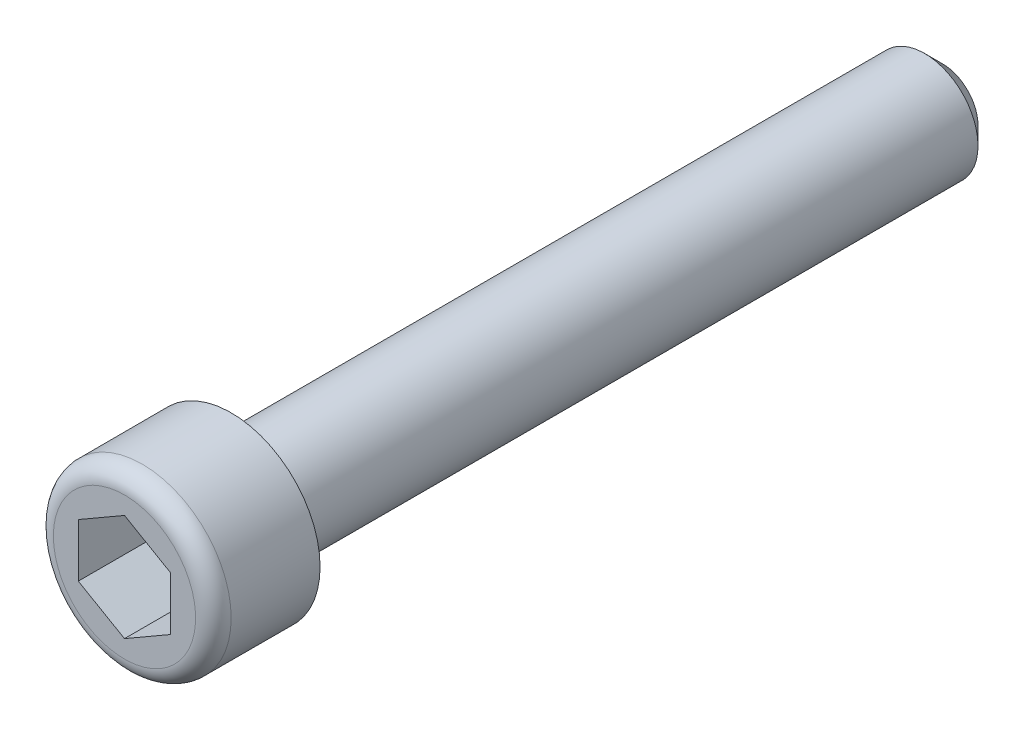
ISO-10303-21;
HEADER;
FILE_DESCRIPTION(('STEP AP214'),'2;1');
FILE_NAME('part.step','',(''),(''),'','','');
FILE_SCHEMA(('AUTOMOTIVE_DESIGN { 1 0 10303 214 1 1 1 1 }'));
ENDSEC;
DATA;
#1=APPLICATION_CONTEXT('core data for automotive mechanical design processes');
#2=APPLICATION_PROTOCOL_DEFINITION('international standard','automotive_design',2000,#1);
#3=PRODUCT_CONTEXT('',#1,'mechanical');
#4=PRODUCT('Part','Part','',(#3));
#5=PRODUCT_RELATED_PRODUCT_CATEGORY('part','',(#4));
#6=PRODUCT_DEFINITION_FORMATION('','',#4);
#7=PRODUCT_DEFINITION_CONTEXT('part definition',#1,'design');
#8=PRODUCT_DEFINITION('design','',#6,#7);
#9=PRODUCT_DEFINITION_SHAPE('','',#8);
#10=(LENGTH_UNIT() NAMED_UNIT(*) SI_UNIT(.MILLI.,.METRE.));
#11=(NAMED_UNIT(*) PLANE_ANGLE_UNIT() SI_UNIT($,.RADIAN.));
#12=(NAMED_UNIT(*) SI_UNIT($,.STERADIAN.) SOLID_ANGLE_UNIT());
#13=UNCERTAINTY_MEASURE_WITH_UNIT(LENGTH_MEASURE(1.E-05),#10,'distance_accuracy_value','');
#14=(GEOMETRIC_REPRESENTATION_CONTEXT(3) GLOBAL_UNCERTAINTY_ASSIGNED_CONTEXT((#13)) GLOBAL_UNIT_ASSIGNED_CONTEXT((#10,
#11,#12)) REPRESENTATION_CONTEXT('',''));
#15=CARTESIAN_POINT('',(0.,0.,0.));
#16=DIRECTION('',(0.,0.,1.));
#17=DIRECTION('',(1.,0.,0.));
#18=AXIS2_PLACEMENT_3D('',#15,#16,#17);
#19=CARTESIAN_POINT('',(0.,0.,0.));
#20=DIRECTION('',(0.,0.,-1.));
#21=DIRECTION('',(-1.,0.,0.));
#22=AXIS2_PLACEMENT_3D('',#19,#20,#21);
#23=PLANE('',#22);
#24=CARTESIAN_POINT('',(0.,0.,0.));
#25=DIRECTION('',(0.,0.,-1.));
#26=DIRECTION('',(-1.,0.,0.));
#27=AXIS2_PLACEMENT_3D('',#24,#25,#26);
#28=CIRCLE('',#27,4.);
#29=CARTESIAN_POINT('',(-4.,0.,0.));
#30=VERTEX_POINT('',#29);
#31=EDGE_CURVE('E41',#30,#30,#28,.F.);
#32=ORIENTED_EDGE('',*,*,#31,.T.);
#33=EDGE_LOOP('',(#32));
#34=FACE_BOUND('',#33,.T.);
#35=DIRECTION('',(-0.866025403784439,-0.5,0.));
#36=VECTOR('',#35,1.);
#37=CARTESIAN_POINT('',(0.,3.,0.));
#38=LINE('',#37,#36);
#39=CARTESIAN_POINT('',(0.,3.,0.));
#40=VERTEX_POINT('',#39);
#41=CARTESIAN_POINT('',(-2.59807621135332,1.5,0.));
#42=VERTEX_POINT('',#41);
#43=EDGE_CURVE('E122',#40,#42,#38,.T.);
#44=ORIENTED_EDGE('',*,*,#43,.F.);
#45=DIRECTION('',(-0.866025403784439,0.5,0.));
#46=VECTOR('',#45,1.);
#47=CARTESIAN_POINT('',(2.59807621135332,1.5,0.));
#48=LINE('',#47,#46);
#49=CARTESIAN_POINT('',(2.59807621135332,1.5,0.));
#50=VERTEX_POINT('',#49);
#51=EDGE_CURVE('E48',#50,#40,#48,.T.);
#52=ORIENTED_EDGE('',*,*,#51,.F.);
#53=DIRECTION('',(0.,1.,0.));
#54=VECTOR('',#53,1.);
#55=CARTESIAN_POINT('',(2.59807621135332,-1.5,0.));
#56=LINE('',#55,#54);
#57=CARTESIAN_POINT('',(2.59807621135332,-1.5,0.));
#58=VERTEX_POINT('',#57);
#59=EDGE_CURVE('E131',#58,#50,#56,.T.);
#60=ORIENTED_EDGE('',*,*,#59,.F.);
#61=DIRECTION('',(0.866025403784439,0.5,0.));
#62=VECTOR('',#61,1.);
#63=CARTESIAN_POINT('',(0.,-3.,0.));
#64=LINE('',#63,#62);
#65=CARTESIAN_POINT('',(0.,-3.,0.));
#66=VERTEX_POINT('',#65);
#67=EDGE_CURVE('E129',#66,#58,#64,.T.);
#68=ORIENTED_EDGE('',*,*,#67,.F.);
#69=DIRECTION('',(0.866025403784439,-0.5,0.));
#70=VECTOR('',#69,1.);
#71=CARTESIAN_POINT('',(-2.59807621135332,-1.5,0.));
#72=LINE('',#71,#70);
#73=CARTESIAN_POINT('',(-2.59807621135332,-1.5,0.));
#74=VERTEX_POINT('',#73);
#75=EDGE_CURVE('E96',#74,#66,#72,.T.);
#76=ORIENTED_EDGE('',*,*,#75,.F.);
#77=DIRECTION('',(0.,-1.,0.));
#78=VECTOR('',#77,1.);
#79=CARTESIAN_POINT('',(-2.59807621135332,1.5,0.));
#80=LINE('',#79,#78);
#81=EDGE_CURVE('E125',#42,#74,#80,.T.);
#82=ORIENTED_EDGE('',*,*,#81,.F.);
#83=EDGE_LOOP('',(#44,#52,#60,#68,#76,#82));
#84=FACE_BOUND('',#83,.T.);
#85=ADVANCED_FACE('F33',(#34,#84),#23,.F.);
#86=CARTESIAN_POINT('',(0.,0.,156.291575098795));
#87=DIRECTION('',(0.,0.,1.));
#88=DIRECTION('',(1.,0.,0.));
#89=AXIS2_PLACEMENT_3D('',#86,#87,#88);
#90=CYLINDRICAL_SURFACE('',#89,5.);
#91=CARTESIAN_POINT('',(0.,0.,-1.));
#92=DIRECTION('',(0.,0.,-1.));
#93=DIRECTION('',(-1.,0.,0.));
#94=AXIS2_PLACEMENT_3D('',#91,#92,#93);
#95=CIRCLE('',#94,5.);
#96=CARTESIAN_POINT('',(-5.,0.,-1.));
#97=VERTEX_POINT('',#96);
#98=EDGE_CURVE('E11',#97,#97,#95,.T.);
#99=ORIENTED_EDGE('',*,*,#98,.T.);
#100=EDGE_LOOP('',(#99));
#101=FACE_BOUND('',#100,.T.);
#102=CARTESIAN_POINT('',(0.,0.,-6.00000000000001));
#103=DIRECTION('',(0.,0.,1.));
#104=DIRECTION('',(1.,0.,0.));
#105=AXIS2_PLACEMENT_3D('',#102,#103,#104);
#106=CIRCLE('',#105,5.);
#107=CARTESIAN_POINT('',(5.,0.,-6.00000000000001));
#108=VERTEX_POINT('',#107);
#109=EDGE_CURVE('E143',#108,#108,#106,.T.);
#110=ORIENTED_EDGE('',*,*,#109,.T.);
#111=EDGE_LOOP('',(#110));
#112=FACE_BOUND('',#111,.T.);
#113=ADVANCED_FACE('F165',(#101,#112),#90,.T.);
#114=CARTESIAN_POINT('',(0.,5.,-6.));
#115=DIRECTION('',(0.,0.,1.));
#116=DIRECTION('',(1.,0.,0.));
#117=AXIS2_PLACEMENT_3D('',#114,#115,#116);
#118=PLANE('',#117);
#119=ORIENTED_EDGE('',*,*,#109,.F.);
#120=EDGE_LOOP('',(#119));
#121=FACE_BOUND('',#120,.T.);
#122=CARTESIAN_POINT('',(0.,0.,-6.00000000000001));
#123=DIRECTION('',(0.,0.,1.));
#124=DIRECTION('',(1.,0.,0.));
#125=AXIS2_PLACEMENT_3D('',#122,#123,#124);
#126=CIRCLE('',#125,3.);
#127=CARTESIAN_POINT('',(3.,0.,-6.00000000000001));
#128=VERTEX_POINT('',#127);
#129=EDGE_CURVE('E135',#128,#128,#126,.T.);
#130=ORIENTED_EDGE('',*,*,#129,.T.);
#131=EDGE_LOOP('',(#130));
#132=FACE_BOUND('',#131,.T.);
#133=ADVANCED_FACE('F170',(#121,#132),#118,.F.);
#134=CARTESIAN_POINT('',(0.,0.,156.291575098795));
#135=DIRECTION('',(0.,0.,1.));
#136=DIRECTION('',(1.,0.,0.));
#137=AXIS2_PLACEMENT_3D('',#134,#135,#136);
#138=CYLINDRICAL_SURFACE('',#137,3.);
#139=CARTESIAN_POINT('',(0.,0.,-45.));
#140=DIRECTION('',(0.,0.,1.));
#141=DIRECTION('',(1.,0.,0.));
#142=AXIS2_PLACEMENT_3D('',#139,#140,#141);
#143=CIRCLE('',#142,3.);
#144=CARTESIAN_POINT('',(3.,0.,-45.));
#145=VERTEX_POINT('',#144);
#146=EDGE_CURVE('E146',#145,#145,#143,.T.);
#147=ORIENTED_EDGE('',*,*,#146,.T.);
#148=EDGE_LOOP('',(#147));
#149=FACE_BOUND('',#148,.T.);
#150=ORIENTED_EDGE('',*,*,#129,.F.);
#151=EDGE_LOOP('',(#150));
#152=FACE_BOUND('',#151,.T.);
#153=ADVANCED_FACE('F176',(#149,#152),#138,.T.);
#154=CARTESIAN_POINT('',(0.,3.,-46.));
#155=DIRECTION('',(0.,0.,1.));
#156=DIRECTION('',(1.,0.,0.));
#157=AXIS2_PLACEMENT_3D('',#154,#155,#156);
#158=PLANE('',#157);
#159=CARTESIAN_POINT('',(0.,0.,-46.));
#160=DIRECTION('',(0.,0.,1.));
#161=DIRECTION('',(1.,0.,0.));
#162=AXIS2_PLACEMENT_3D('',#159,#160,#161);
#163=CIRCLE('',#162,1.99999999999999);
#164=CARTESIAN_POINT('',(1.99999999999999,0.,-46.));
#165=VERTEX_POINT('',#164);
#166=EDGE_CURVE('E149',#165,#165,#163,.F.);
#167=ORIENTED_EDGE('',*,*,#166,.T.);
#168=EDGE_LOOP('',(#167));
#169=FACE_BOUND('',#168,.T.);
#170=ADVANCED_FACE('F180',(#169),#158,.F.);
#171=CARTESIAN_POINT('',(2.59807621135332,1.5,-4.5));
#172=DIRECTION('',(0.5,0.866025403784439,0.));
#173=DIRECTION('',(-0.866025403784439,0.5,0.));
#174=AXIS2_PLACEMENT_3D('',#171,#172,#173);
#175=PLANE('',#174);
#176=ORIENTED_EDGE('',*,*,#51,.T.);
#177=DIRECTION('',(0.,0.,1.));
#178=VECTOR('',#177,1.);
#179=CARTESIAN_POINT('',(0.,3.,-4.5));
#180=LINE('',#179,#178);
#181=CARTESIAN_POINT('',(0.,3.,-4.5));
#182=VERTEX_POINT('',#181);
#183=EDGE_CURVE('E78',#182,#40,#180,.T.);
#184=ORIENTED_EDGE('',*,*,#183,.F.);
#185=DIRECTION('',(-0.866025403784439,0.5,0.));
#186=VECTOR('',#185,1.);
#187=CARTESIAN_POINT('',(2.59807621135332,1.5,-4.5));
#188=LINE('',#187,#186);
#189=CARTESIAN_POINT('',(2.59807621135332,1.5,-4.5));
#190=VERTEX_POINT('',#189);
#191=EDGE_CURVE('E133',#190,#182,#188,.T.);
#192=ORIENTED_EDGE('',*,*,#191,.F.);
#193=DIRECTION('',(0.,0.,1.));
#194=VECTOR('',#193,1.);
#195=CARTESIAN_POINT('',(2.59807621135332,1.5,-4.5));
#196=LINE('',#195,#194);
#197=EDGE_CURVE('E56',#190,#50,#196,.T.);
#198=ORIENTED_EDGE('',*,*,#197,.T.);
#199=EDGE_LOOP('',(#176,#184,#192,#198));
#200=FACE_BOUND('',#199,.T.);
#201=ADVANCED_FACE('F184',(#200),#175,.F.);
#202=CARTESIAN_POINT('',(2.59807621135332,-1.5,-4.5));
#203=DIRECTION('',(1.,0.,0.));
#204=DIRECTION('',(0.,1.,0.));
#205=AXIS2_PLACEMENT_3D('',#202,#203,#204);
#206=PLANE('',#205);
#207=ORIENTED_EDGE('',*,*,#59,.T.);
#208=ORIENTED_EDGE('',*,*,#197,.F.);
#209=DIRECTION('',(0.,1.,0.));
#210=VECTOR('',#209,1.);
#211=CARTESIAN_POINT('',(2.59807621135332,-1.5,-4.5));
#212=LINE('',#211,#210);
#213=CARTESIAN_POINT('',(2.59807621135332,-1.5,-4.5));
#214=VERTEX_POINT('',#213);
#215=EDGE_CURVE('E108',#214,#190,#212,.T.);
#216=ORIENTED_EDGE('',*,*,#215,.F.);
#217=DIRECTION('',(0.,0.,1.));
#218=VECTOR('',#217,1.);
#219=CARTESIAN_POINT('',(2.59807621135332,-1.5,-4.5));
#220=LINE('',#219,#218);
#221=EDGE_CURVE('E100',#214,#58,#220,.T.);
#222=ORIENTED_EDGE('',*,*,#221,.T.);
#223=EDGE_LOOP('',(#207,#208,#216,#222));
#224=FACE_BOUND('',#223,.T.);
#225=ADVANCED_FACE('F188',(#224),#206,.F.);
#226=CARTESIAN_POINT('',(0.,-3.,-4.5));
#227=DIRECTION('',(0.5,-0.866025403784439,0.));
#228=DIRECTION('',(0.866025403784439,0.5,0.));
#229=AXIS2_PLACEMENT_3D('',#226,#227,#228);
#230=PLANE('',#229);
#231=ORIENTED_EDGE('',*,*,#67,.T.);
#232=ORIENTED_EDGE('',*,*,#221,.F.);
#233=DIRECTION('',(0.866025403784439,0.5,0.));
#234=VECTOR('',#233,1.);
#235=CARTESIAN_POINT('',(0.,-3.,-4.5));
#236=LINE('',#235,#234);
#237=CARTESIAN_POINT('',(0.,-3.,-4.5));
#238=VERTEX_POINT('',#237);
#239=EDGE_CURVE('E104',#238,#214,#236,.T.);
#240=ORIENTED_EDGE('',*,*,#239,.F.);
#241=DIRECTION('',(0.,0.,1.));
#242=VECTOR('',#241,1.);
#243=CARTESIAN_POINT('',(0.,-3.,-4.5));
#244=LINE('',#243,#242);
#245=EDGE_CURVE('E89',#238,#66,#244,.T.);
#246=ORIENTED_EDGE('',*,*,#245,.T.);
#247=EDGE_LOOP('',(#231,#232,#240,#246));
#248=FACE_BOUND('',#247,.T.);
#249=ADVANCED_FACE('F105',(#248),#230,.F.);
#250=CARTESIAN_POINT('',(-2.59807621135332,-1.5,-4.5));
#251=DIRECTION('',(-0.5,-0.866025403784439,0.));
#252=DIRECTION('',(0.866025403784439,-0.5,0.));
#253=AXIS2_PLACEMENT_3D('',#250,#251,#252);
#254=PLANE('',#253);
#255=ORIENTED_EDGE('',*,*,#75,.T.);
#256=ORIENTED_EDGE('',*,*,#245,.F.);
#257=DIRECTION('',(0.866025403784439,-0.5,0.));
#258=VECTOR('',#257,1.);
#259=CARTESIAN_POINT('',(-2.59807621135332,-1.5,-4.5));
#260=LINE('',#259,#258);
#261=CARTESIAN_POINT('',(-2.59807621135332,-1.5,-4.5));
#262=VERTEX_POINT('',#261);
#263=EDGE_CURVE('E93',#262,#238,#260,.T.);
#264=ORIENTED_EDGE('',*,*,#263,.F.);
#265=DIRECTION('',(0.,0.,1.));
#266=VECTOR('',#265,1.);
#267=CARTESIAN_POINT('',(-2.59807621135332,-1.5,-4.5));
#268=LINE('',#267,#266);
#269=EDGE_CURVE('E101',#262,#74,#268,.T.);
#270=ORIENTED_EDGE('',*,*,#269,.T.);
#271=EDGE_LOOP('',(#255,#256,#264,#270));
#272=FACE_BOUND('',#271,.T.);
#273=ADVANCED_FACE('F91',(#272),#254,.F.);
#274=CARTESIAN_POINT('',(-2.59807621135332,1.5,-4.5));
#275=DIRECTION('',(-1.,0.,0.));
#276=DIRECTION('',(0.,-1.,0.));
#277=AXIS2_PLACEMENT_3D('',#274,#275,#276);
#278=PLANE('',#277);
#279=ORIENTED_EDGE('',*,*,#81,.T.);
#280=ORIENTED_EDGE('',*,*,#269,.F.);
#281=DIRECTION('',(0.,-1.,0.));
#282=VECTOR('',#281,1.);
#283=CARTESIAN_POINT('',(-2.59807621135332,1.5,-4.5));
#284=LINE('',#283,#282);
#285=CARTESIAN_POINT('',(-2.59807621135332,1.5,-4.5));
#286=VERTEX_POINT('',#285);
#287=EDGE_CURVE('E114',#286,#262,#284,.T.);
#288=ORIENTED_EDGE('',*,*,#287,.F.);
#289=DIRECTION('',(0.,0.,1.));
#290=VECTOR('',#289,1.);
#291=CARTESIAN_POINT('',(-2.59807621135332,1.5,-4.5));
#292=LINE('',#291,#290);
#293=EDGE_CURVE('E138',#286,#42,#292,.T.);
#294=ORIENTED_EDGE('',*,*,#293,.T.);
#295=EDGE_LOOP('',(#279,#280,#288,#294));
#296=FACE_BOUND('',#295,.T.);
#297=ADVANCED_FACE('F192',(#296),#278,.F.);
#298=CARTESIAN_POINT('',(0.,3.,-4.5));
#299=DIRECTION('',(-0.5,0.866025403784439,0.));
#300=DIRECTION('',(-0.866025403784439,-0.5,0.));
#301=AXIS2_PLACEMENT_3D('',#298,#299,#300);
#302=PLANE('',#301);
#303=ORIENTED_EDGE('',*,*,#43,.T.);
#304=ORIENTED_EDGE('',*,*,#293,.F.);
#305=DIRECTION('',(-0.866025403784439,-0.5,0.));
#306=VECTOR('',#305,1.);
#307=CARTESIAN_POINT('',(0.,3.,-4.5));
#308=LINE('',#307,#306);
#309=EDGE_CURVE('E116',#182,#286,#308,.T.);
#310=ORIENTED_EDGE('',*,*,#309,.F.);
#311=ORIENTED_EDGE('',*,*,#183,.T.);
#312=EDGE_LOOP('',(#303,#304,#310,#311));
#313=FACE_BOUND('',#312,.T.);
#314=ADVANCED_FACE('F189',(#313),#302,.F.);
#315=CARTESIAN_POINT('',(0.,0.,-4.5));
#316=DIRECTION('',(0.,0.,1.));
#317=DIRECTION('',(1.,0.,0.));
#318=AXIS2_PLACEMENT_3D('',#315,#316,#317);
#319=PLANE('',#318);
#320=ORIENTED_EDGE('',*,*,#191,.T.);
#321=ORIENTED_EDGE('',*,*,#309,.T.);
#322=ORIENTED_EDGE('',*,*,#287,.T.);
#323=ORIENTED_EDGE('',*,*,#263,.T.);
#324=ORIENTED_EDGE('',*,*,#239,.T.);
#325=ORIENTED_EDGE('',*,*,#215,.T.);
#326=EDGE_LOOP('',(#320,#321,#322,#323,#324,#325));
#327=FACE_BOUND('',#326,.T.);
#328=ADVANCED_FACE('F111',(#327),#319,.T.);
#329=CARTESIAN_POINT('',(0.,0.,-45.));
#330=DIRECTION('',(0.,0.,1.));
#331=DIRECTION('',(1.,0.,0.));
#332=AXIS2_PLACEMENT_3D('',#329,#330,#331);
#333=CONICAL_SURFACE('',#332,3.,0.785398163397444);
#334=ORIENTED_EDGE('',*,*,#166,.F.);
#335=EDGE_LOOP('',(#334));
#336=FACE_BOUND('',#335,.T.);
#337=ORIENTED_EDGE('',*,*,#146,.F.);
#338=EDGE_LOOP('',(#337));
#339=FACE_BOUND('',#338,.T.);
#340=ADVANCED_FACE('F157',(#336,#339),#333,.T.);
#341=CARTESIAN_POINT('',(0.,0.,-1.));
#342=DIRECTION('',(0.,0.,-1.));
#343=DIRECTION('',(-1.,0.,0.));
#344=AXIS2_PLACEMENT_3D('',#341,#342,#343);
#345=TOROIDAL_SURFACE('',#344,4.,1.);
#346=ORIENTED_EDGE('',*,*,#98,.F.);
#347=EDGE_LOOP('',(#346));
#348=FACE_BOUND('',#347,.T.);
#349=ORIENTED_EDGE('',*,*,#31,.F.);
#350=EDGE_LOOP('',(#349));
#351=FACE_BOUND('',#350,.T.);
#352=ADVANCED_FACE('F35',(#348,#351),#345,.T.);
#353=CLOSED_SHELL('',(#85,#113,#133,#153,#170,#201,#225,#249,#273,#297,#314,#328,#340,#352));
#354=MANIFOLD_SOLID_BREP('B2',#353);
#355=ADVANCED_BREP_SHAPE_REPRESENTATION('',(#18,#354),#14);
#356=SHAPE_DEFINITION_REPRESENTATION(#9,#355);
ENDSEC;
END-ISO-10303-21;
